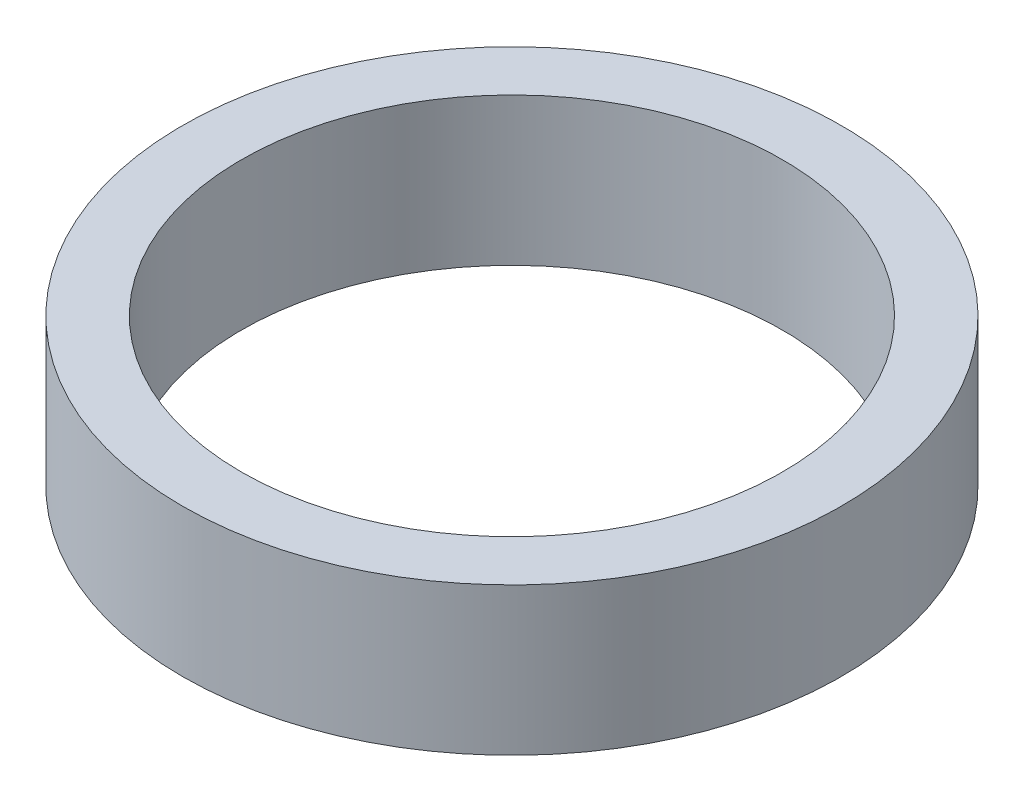
ISO-10303-21;
HEADER;
FILE_DESCRIPTION(('STEP AP214'),'2;1');
FILE_NAME('part.step','',(''),(''),'','','');
FILE_SCHEMA(('AUTOMOTIVE_DESIGN { 1 0 10303 214 1 1 1 1 }'));
ENDSEC;
DATA;
#1=APPLICATION_CONTEXT('core data for automotive mechanical design processes');
#2=APPLICATION_PROTOCOL_DEFINITION('international standard','automotive_design',2000,#1);
#3=PRODUCT_CONTEXT('',#1,'mechanical');
#4=PRODUCT('Part','Part','',(#3));
#5=PRODUCT_RELATED_PRODUCT_CATEGORY('part','',(#4));
#6=PRODUCT_DEFINITION_FORMATION('','',#4);
#7=PRODUCT_DEFINITION_CONTEXT('part definition',#1,'design');
#8=PRODUCT_DEFINITION('design','',#6,#7);
#9=PRODUCT_DEFINITION_SHAPE('','',#8);
#10=(LENGTH_UNIT() NAMED_UNIT(*) SI_UNIT(.MILLI.,.METRE.));
#11=(NAMED_UNIT(*) PLANE_ANGLE_UNIT() SI_UNIT($,.RADIAN.));
#12=(NAMED_UNIT(*) SI_UNIT($,.STERADIAN.) SOLID_ANGLE_UNIT());
#13=UNCERTAINTY_MEASURE_WITH_UNIT(LENGTH_MEASURE(1.E-05),#10,'distance_accuracy_value','');
#14=(GEOMETRIC_REPRESENTATION_CONTEXT(3) GLOBAL_UNCERTAINTY_ASSIGNED_CONTEXT((#13)) GLOBAL_UNIT_ASSIGNED_CONTEXT((#10,
#11,#12)) REPRESENTATION_CONTEXT('',''));
#15=CARTESIAN_POINT('',(0.,0.,0.));
#16=DIRECTION('',(0.,0.,1.));
#17=DIRECTION('',(1.,0.,0.));
#18=AXIS2_PLACEMENT_3D('',#15,#16,#17);
#19=CARTESIAN_POINT('',(0.,1.5,0.));
#20=DIRECTION('',(0.,1.,0.));
#21=DIRECTION('',(0.,0.,1.));
#22=AXIS2_PLACEMENT_3D('',#19,#20,#21);
#23=PLANE('',#22);
#24=CARTESIAN_POINT('',(0.,1.5,0.));
#25=DIRECTION('',(0.,1.,0.));
#26=DIRECTION('',(0.,0.,1.));
#27=AXIS2_PLACEMENT_3D('',#24,#25,#26);
#28=CIRCLE('',#27,3.35);
#29=CARTESIAN_POINT('',(0.,1.5,3.35));
#30=VERTEX_POINT('',#29);
#31=EDGE_CURVE('E10',#30,#30,#28,.T.);
#32=ORIENTED_EDGE('',*,*,#31,.T.);
#33=EDGE_LOOP('',(#32));
#34=FACE_BOUND('',#33,.T.);
#35=CARTESIAN_POINT('',(0.,1.5,0.));
#36=DIRECTION('',(0.,1.,0.));
#37=DIRECTION('',(0.,0.,1.));
#38=AXIS2_PLACEMENT_3D('',#35,#36,#37);
#39=CIRCLE('',#38,2.75);
#40=CARTESIAN_POINT('',(0.,1.5,2.75));
#41=VERTEX_POINT('',#40);
#42=EDGE_CURVE('E43',#41,#41,#39,.T.);
#43=ORIENTED_EDGE('',*,*,#42,.F.);
#44=EDGE_LOOP('',(#43));
#45=FACE_BOUND('',#44,.T.);
#46=ADVANCED_FACE('F32',(#34,#45),#23,.T.);
#47=CARTESIAN_POINT('',(0.,0.,0.));
#48=DIRECTION('',(0.,1.,0.));
#49=DIRECTION('',(0.,0.,1.));
#50=AXIS2_PLACEMENT_3D('',#47,#48,#49);
#51=PLANE('',#50);
#52=CARTESIAN_POINT('',(0.,0.,0.));
#53=DIRECTION('',(0.,1.,0.));
#54=DIRECTION('',(0.,0.,1.));
#55=AXIS2_PLACEMENT_3D('',#52,#53,#54);
#56=CIRCLE('',#55,3.35);
#57=CARTESIAN_POINT('',(0.,0.,3.35));
#58=VERTEX_POINT('',#57);
#59=EDGE_CURVE('E36',#58,#58,#56,.T.);
#60=ORIENTED_EDGE('',*,*,#59,.F.);
#61=EDGE_LOOP('',(#60));
#62=FACE_BOUND('',#61,.T.);
#63=CARTESIAN_POINT('',(0.,0.,0.));
#64=DIRECTION('',(0.,1.,0.));
#65=DIRECTION('',(0.,0.,1.));
#66=AXIS2_PLACEMENT_3D('',#63,#64,#65);
#67=CIRCLE('',#66,2.75);
#68=CARTESIAN_POINT('',(0.,0.,2.75));
#69=VERTEX_POINT('',#68);
#70=EDGE_CURVE('E45',#69,#69,#67,.T.);
#71=ORIENTED_EDGE('',*,*,#70,.T.);
#72=EDGE_LOOP('',(#71));
#73=FACE_BOUND('',#72,.T.);
#74=ADVANCED_FACE('F55',(#62,#73),#51,.F.);
#75=CARTESIAN_POINT('',(0.,1.5,0.));
#76=DIRECTION('',(0.,-1.,0.));
#77=DIRECTION('',(0.,0.,-1.));
#78=AXIS2_PLACEMENT_3D('',#75,#76,#77);
#79=CYLINDRICAL_SURFACE('',#78,3.35);
#80=ORIENTED_EDGE('',*,*,#31,.F.);
#81=EDGE_LOOP('',(#80));
#82=FACE_BOUND('',#81,.T.);
#83=ORIENTED_EDGE('',*,*,#59,.T.);
#84=EDGE_LOOP('',(#83));
#85=FACE_BOUND('',#84,.T.);
#86=ADVANCED_FACE('F34',(#82,#85),#79,.T.);
#87=CARTESIAN_POINT('',(0.,1.5,0.));
#88=DIRECTION('',(0.,-1.,0.));
#89=DIRECTION('',(0.,0.,-1.));
#90=AXIS2_PLACEMENT_3D('',#87,#88,#89);
#91=CYLINDRICAL_SURFACE('',#90,2.75);
#92=ORIENTED_EDGE('',*,*,#42,.T.);
#93=EDGE_LOOP('',(#92));
#94=FACE_BOUND('',#93,.T.);
#95=ORIENTED_EDGE('',*,*,#70,.F.);
#96=EDGE_LOOP('',(#95));
#97=FACE_BOUND('',#96,.T.);
#98=ADVANCED_FACE('F51',(#94,#97),#91,.F.);
#99=CLOSED_SHELL('',(#46,#74,#86,#98));
#100=MANIFOLD_SOLID_BREP('B2',#99);
#101=ADVANCED_BREP_SHAPE_REPRESENTATION('',(#18,#100),#14);
#102=SHAPE_DEFINITION_REPRESENTATION(#9,#101);
ENDSEC;
END-ISO-10303-21;
